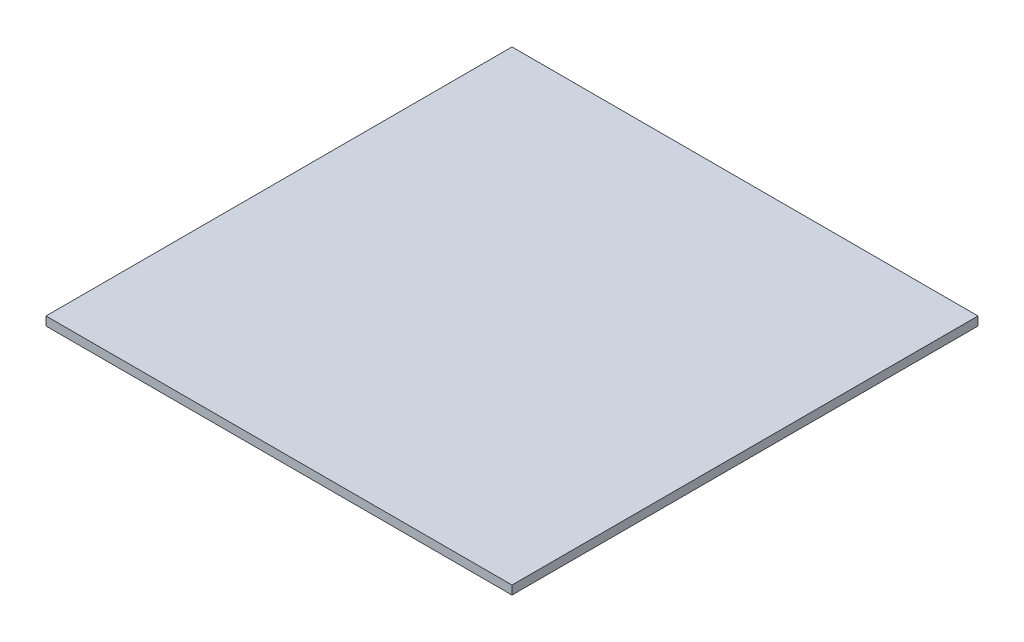
ISO-10303-21;
HEADER;
FILE_DESCRIPTION(('STEP AP214'),'2;1');
FILE_NAME('part.step','',(''),(''),'','','');
FILE_SCHEMA(('AUTOMOTIVE_DESIGN { 1 0 10303 214 1 1 1 1 }'));
ENDSEC;
DATA;
#1=APPLICATION_CONTEXT('core data for automotive mechanical design processes');
#2=APPLICATION_PROTOCOL_DEFINITION('international standard','automotive_design',2000,#1);
#3=PRODUCT_CONTEXT('',#1,'mechanical');
#4=PRODUCT('Part','Part','',(#3));
#5=PRODUCT_RELATED_PRODUCT_CATEGORY('part','',(#4));
#6=PRODUCT_DEFINITION_FORMATION('','',#4);
#7=PRODUCT_DEFINITION_CONTEXT('part definition',#1,'design');
#8=PRODUCT_DEFINITION('design','',#6,#7);
#9=PRODUCT_DEFINITION_SHAPE('','',#8);
#10=(LENGTH_UNIT() NAMED_UNIT(*) SI_UNIT(.MILLI.,.METRE.));
#11=(NAMED_UNIT(*) PLANE_ANGLE_UNIT() SI_UNIT($,.RADIAN.));
#12=(NAMED_UNIT(*) SI_UNIT($,.STERADIAN.) SOLID_ANGLE_UNIT());
#13=UNCERTAINTY_MEASURE_WITH_UNIT(LENGTH_MEASURE(1.E-05),#10,'distance_accuracy_value','');
#14=(GEOMETRIC_REPRESENTATION_CONTEXT(3) GLOBAL_UNCERTAINTY_ASSIGNED_CONTEXT((#13)) GLOBAL_UNIT_ASSIGNED_CONTEXT((#10,
#11,#12)) REPRESENTATION_CONTEXT('',''));
#15=CARTESIAN_POINT('',(0.,0.,0.));
#16=DIRECTION('',(0.,0.,1.));
#17=DIRECTION('',(1.,0.,0.));
#18=AXIS2_PLACEMENT_3D('',#15,#16,#17);
#19=CARTESIAN_POINT('',(0.,1.5,-80.));
#20=DIRECTION('',(1.,0.,0.));
#21=DIRECTION('',(0.,0.,-1.));
#22=AXIS2_PLACEMENT_3D('',#19,#20,#21);
#23=PLANE('',#22);
#24=DIRECTION('',(0.,0.,1.));
#25=VECTOR('',#24,1.);
#26=CARTESIAN_POINT('',(0.,0.,-80.));
#27=LINE('',#26,#25);
#28=CARTESIAN_POINT('',(0.,0.,-80.));
#29=VERTEX_POINT('',#28);
#30=CARTESIAN_POINT('',(0.,0.,0.));
#31=VERTEX_POINT('',#30);
#32=EDGE_CURVE('E97',#29,#31,#27,.T.);
#33=ORIENTED_EDGE('',*,*,#32,.T.);
#34=DIRECTION('',(0.,-1.,0.));
#35=VECTOR('',#34,1.);
#36=CARTESIAN_POINT('',(0.,1.5,0.));
#37=LINE('',#36,#35);
#38=CARTESIAN_POINT('',(0.,1.5,0.));
#39=VERTEX_POINT('',#38);
#40=EDGE_CURVE('E11',#39,#31,#37,.T.);
#41=ORIENTED_EDGE('',*,*,#40,.F.);
#42=DIRECTION('',(0.,0.,1.));
#43=VECTOR('',#42,1.);
#44=CARTESIAN_POINT('',(0.,1.5,-80.));
#45=LINE('',#44,#43);
#46=CARTESIAN_POINT('',(0.,1.5,-80.));
#47=VERTEX_POINT('',#46);
#48=EDGE_CURVE('E85',#47,#39,#45,.T.);
#49=ORIENTED_EDGE('',*,*,#48,.F.);
#50=DIRECTION('',(0.,-1.,0.));
#51=VECTOR('',#50,1.);
#52=CARTESIAN_POINT('',(0.,1.5,-80.));
#53=LINE('',#52,#51);
#54=EDGE_CURVE('E93',#47,#29,#53,.T.);
#55=ORIENTED_EDGE('',*,*,#54,.T.);
#56=EDGE_LOOP('',(#33,#41,#49,#55));
#57=FACE_BOUND('',#56,.T.);
#58=ADVANCED_FACE('F34',(#57),#23,.F.);
#59=CARTESIAN_POINT('',(0.,1.5,0.));
#60=DIRECTION('',(0.,0.,-1.));
#61=DIRECTION('',(-1.,0.,0.));
#62=AXIS2_PLACEMENT_3D('',#59,#60,#61);
#63=PLANE('',#62);
#64=DIRECTION('',(1.,0.,0.));
#65=VECTOR('',#64,1.);
#66=CARTESIAN_POINT('',(0.,0.,0.));
#67=LINE('',#66,#65);
#68=CARTESIAN_POINT('',(80.,0.,0.));
#69=VERTEX_POINT('',#68);
#70=EDGE_CURVE('E89',#31,#69,#67,.T.);
#71=ORIENTED_EDGE('',*,*,#70,.T.);
#72=DIRECTION('',(0.,-1.,0.));
#73=VECTOR('',#72,1.);
#74=CARTESIAN_POINT('',(80.,1.5,0.));
#75=LINE('',#74,#73);
#76=CARTESIAN_POINT('',(80.,1.5,0.));
#77=VERTEX_POINT('',#76);
#78=EDGE_CURVE('E42',#77,#69,#75,.T.);
#79=ORIENTED_EDGE('',*,*,#78,.F.);
#80=DIRECTION('',(1.,0.,0.));
#81=VECTOR('',#80,1.);
#82=CARTESIAN_POINT('',(0.,1.5,0.));
#83=LINE('',#82,#81);
#84=EDGE_CURVE('E80',#39,#77,#83,.T.);
#85=ORIENTED_EDGE('',*,*,#84,.F.);
#86=ORIENTED_EDGE('',*,*,#40,.T.);
#87=EDGE_LOOP('',(#71,#79,#85,#86));
#88=FACE_BOUND('',#87,.T.);
#89=ADVANCED_FACE('F88',(#88),#63,.F.);
#90=CARTESIAN_POINT('',(80.,1.5,-80.));
#91=DIRECTION('',(-1.,0.,0.));
#92=DIRECTION('',(0.,0.,1.));
#93=AXIS2_PLACEMENT_3D('',#90,#91,#92);
#94=PLANE('',#93);
#95=DIRECTION('',(0.,0.,-1.));
#96=VECTOR('',#95,1.);
#97=CARTESIAN_POINT('',(80.,0.,-80.));
#98=LINE('',#97,#96);
#99=CARTESIAN_POINT('',(80.,0.,-80.));
#100=VERTEX_POINT('',#99);
#101=EDGE_CURVE('E67',#69,#100,#98,.T.);
#102=ORIENTED_EDGE('',*,*,#101,.T.);
#103=DIRECTION('',(0.,-1.,0.));
#104=VECTOR('',#103,1.);
#105=CARTESIAN_POINT('',(80.,1.5,-80.));
#106=LINE('',#105,#104);
#107=CARTESIAN_POINT('',(80.,1.5,-80.));
#108=VERTEX_POINT('',#107);
#109=EDGE_CURVE('E90',#108,#100,#106,.T.);
#110=ORIENTED_EDGE('',*,*,#109,.F.);
#111=DIRECTION('',(0.,0.,-1.));
#112=VECTOR('',#111,1.);
#113=CARTESIAN_POINT('',(80.,1.5,-80.));
#114=LINE('',#113,#112);
#115=EDGE_CURVE('E83',#77,#108,#114,.T.);
#116=ORIENTED_EDGE('',*,*,#115,.F.);
#117=ORIENTED_EDGE('',*,*,#78,.T.);
#118=EDGE_LOOP('',(#102,#110,#116,#117));
#119=FACE_BOUND('',#118,.T.);
#120=ADVANCED_FACE('F91',(#119),#94,.F.);
#121=CARTESIAN_POINT('',(0.,1.5,-80.));
#122=DIRECTION('',(0.,0.,1.));
#123=DIRECTION('',(1.,0.,0.));
#124=AXIS2_PLACEMENT_3D('',#121,#122,#123);
#125=PLANE('',#124);
#126=DIRECTION('',(-1.,0.,0.));
#127=VECTOR('',#126,1.);
#128=CARTESIAN_POINT('',(0.,0.,-80.));
#129=LINE('',#128,#127);
#130=EDGE_CURVE('E73',#100,#29,#129,.T.);
#131=ORIENTED_EDGE('',*,*,#130,.T.);
#132=ORIENTED_EDGE('',*,*,#54,.F.);
#133=DIRECTION('',(-1.,0.,0.));
#134=VECTOR('',#133,1.);
#135=CARTESIAN_POINT('',(0.,1.5,-80.));
#136=LINE('',#135,#134);
#137=EDGE_CURVE('E50',#108,#47,#136,.T.);
#138=ORIENTED_EDGE('',*,*,#137,.F.);
#139=ORIENTED_EDGE('',*,*,#109,.T.);
#140=EDGE_LOOP('',(#131,#132,#138,#139));
#141=FACE_BOUND('',#140,.T.);
#142=ADVANCED_FACE('F104',(#141),#125,.F.);
#143=CARTESIAN_POINT('',(0.,1.5,0.));
#144=DIRECTION('',(0.,1.,0.));
#145=DIRECTION('',(0.,0.,1.));
#146=AXIS2_PLACEMENT_3D('',#143,#144,#145);
#147=PLANE('',#146);
#148=ORIENTED_EDGE('',*,*,#48,.T.);
#149=ORIENTED_EDGE('',*,*,#84,.T.);
#150=ORIENTED_EDGE('',*,*,#115,.T.);
#151=ORIENTED_EDGE('',*,*,#137,.T.);
#152=EDGE_LOOP('',(#148,#149,#150,#151));
#153=FACE_BOUND('',#152,.T.);
#154=ADVANCED_FACE('F81',(#153),#147,.T.);
#155=CARTESIAN_POINT('',(0.,0.,0.));
#156=DIRECTION('',(0.,1.,0.));
#157=DIRECTION('',(0.,0.,1.));
#158=AXIS2_PLACEMENT_3D('',#155,#156,#157);
#159=PLANE('',#158);
#160=ORIENTED_EDGE('',*,*,#32,.F.);
#161=ORIENTED_EDGE('',*,*,#130,.F.);
#162=ORIENTED_EDGE('',*,*,#101,.F.);
#163=ORIENTED_EDGE('',*,*,#70,.F.);
#164=EDGE_LOOP('',(#160,#161,#162,#163));
#165=FACE_BOUND('',#164,.T.);
#166=ADVANCED_FACE('F107',(#165),#159,.F.);
#167=CLOSED_SHELL('',(#58,#89,#120,#142,#154,#166));
#168=MANIFOLD_SOLID_BREP('B2',#167);
#169=ADVANCED_BREP_SHAPE_REPRESENTATION('',(#18,#168),#14);
#170=SHAPE_DEFINITION_REPRESENTATION(#9,#169);
ENDSEC;
END-ISO-10303-21;
